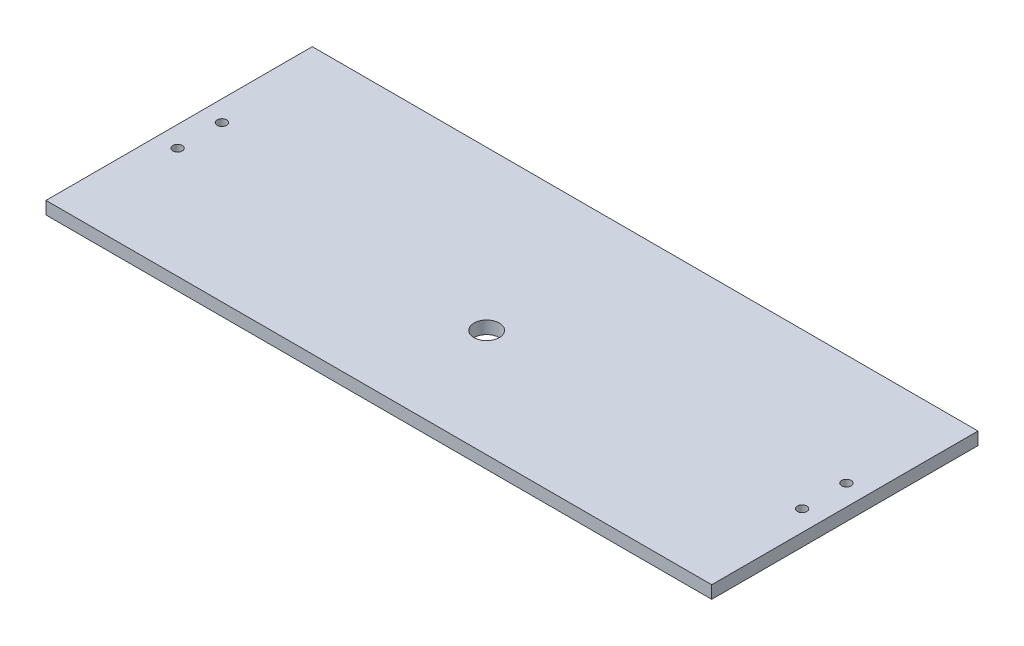
ISO-10303-21;
HEADER;
FILE_DESCRIPTION(('STEP AP214'),'2;1');
FILE_NAME('part.step','',(''),(''),'','','');
FILE_SCHEMA(('AUTOMOTIVE_DESIGN { 1 0 10303 214 1 1 1 1 }'));
ENDSEC;
DATA;
#1=APPLICATION_CONTEXT('core data for automotive mechanical design processes');
#2=APPLICATION_PROTOCOL_DEFINITION('international standard','automotive_design',2000,#1);
#3=PRODUCT_CONTEXT('',#1,'mechanical');
#4=PRODUCT('Part','Part','',(#3));
#5=PRODUCT_RELATED_PRODUCT_CATEGORY('part','',(#4));
#6=PRODUCT_DEFINITION_FORMATION('','',#4);
#7=PRODUCT_DEFINITION_CONTEXT('part definition',#1,'design');
#8=PRODUCT_DEFINITION('design','',#6,#7);
#9=PRODUCT_DEFINITION_SHAPE('','',#8);
#10=(LENGTH_UNIT() NAMED_UNIT(*) SI_UNIT(.MILLI.,.METRE.));
#11=(NAMED_UNIT(*) PLANE_ANGLE_UNIT() SI_UNIT($,.RADIAN.));
#12=(NAMED_UNIT(*) SI_UNIT($,.STERADIAN.) SOLID_ANGLE_UNIT());
#13=UNCERTAINTY_MEASURE_WITH_UNIT(LENGTH_MEASURE(1.E-05),#10,'distance_accuracy_value','');
#14=(GEOMETRIC_REPRESENTATION_CONTEXT(3) GLOBAL_UNCERTAINTY_ASSIGNED_CONTEXT((#13)) GLOBAL_UNIT_ASSIGNED_CONTEXT((#10,
#11,#12)) REPRESENTATION_CONTEXT('',''));
#15=CARTESIAN_POINT('',(0.,0.,0.));
#16=DIRECTION('',(0.,0.,1.));
#17=DIRECTION('',(1.,0.,0.));
#18=AXIS2_PLACEMENT_3D('',#15,#16,#17);
#19=CARTESIAN_POINT('',(119.498385096091,707.628389677579,-82.4394674818287));
#20=DIRECTION('',(1.,0.,0.));
#21=DIRECTION('',(0.,0.,-1.));
#22=AXIS2_PLACEMENT_3D('',#19,#20,#21);
#23=PLANE('',#22);
#24=DIRECTION('',(0.,0.,1.));
#25=VECTOR('',#24,1.);
#26=CARTESIAN_POINT('',(119.498385096091,703.628389677579,-82.4394674818287));
#27=LINE('',#26,#25);
#28=CARTESIAN_POINT('',(119.498385096091,703.628389677579,-82.4394674818287));
#29=VERTEX_POINT('',#28);
#30=CARTESIAN_POINT('',(119.498385096091,703.628389677579,1.56053251817128));
#31=VERTEX_POINT('',#30);
#32=EDGE_CURVE('E97',#29,#31,#27,.T.);
#33=ORIENTED_EDGE('',*,*,#32,.F.);
#34=DIRECTION('',(0.,-1.,0.));
#35=VECTOR('',#34,1.);
#36=CARTESIAN_POINT('',(119.498385096091,707.628389677579,-82.4394674818287));
#37=LINE('',#36,#35);
#38=CARTESIAN_POINT('',(119.498385096091,707.628389677579,-82.4394674818287));
#39=VERTEX_POINT('',#38);
#40=EDGE_CURVE('E11',#39,#29,#37,.T.);
#41=ORIENTED_EDGE('',*,*,#40,.F.);
#42=DIRECTION('',(0.,0.,1.));
#43=VECTOR('',#42,1.);
#44=CARTESIAN_POINT('',(119.498385096091,707.628389677579,-82.4394674818287));
#45=LINE('',#44,#43);
#46=CARTESIAN_POINT('',(119.498385096091,707.628389677579,1.56053251817128));
#47=VERTEX_POINT('',#46);
#48=EDGE_CURVE('E90',#39,#47,#45,.T.);
#49=ORIENTED_EDGE('',*,*,#48,.T.);
#50=DIRECTION('',(0.,-1.,0.));
#51=VECTOR('',#50,1.);
#52=CARTESIAN_POINT('',(119.498385096091,707.628389677579,1.56053251817128));
#53=LINE('',#52,#51);
#54=EDGE_CURVE('E35',#47,#31,#53,.T.);
#55=ORIENTED_EDGE('',*,*,#54,.T.);
#56=EDGE_LOOP('',(#33,#41,#49,#55));
#57=FACE_BOUND('',#56,.T.);
#58=ADVANCED_FACE('F32',(#57),#23,.T.);
#59=CARTESIAN_POINT('',(119.498385096091,707.628389677579,-82.4394674818287));
#60=DIRECTION('',(0.,0.,-1.));
#61=DIRECTION('',(0.,1.,0.));
#62=AXIS2_PLACEMENT_3D('',#59,#60,#61);
#63=PLANE('',#62);
#64=DIRECTION('',(1.,0.,0.));
#65=VECTOR('',#64,1.);
#66=CARTESIAN_POINT('',(119.498385096091,703.628389677579,-82.4394674818287));
#67=LINE('',#66,#65);
#68=CARTESIAN_POINT('',(-90.5016149039087,703.628389677579,-82.4394674818287));
#69=VERTEX_POINT('',#68);
#70=EDGE_CURVE('E92',#69,#29,#67,.T.);
#71=ORIENTED_EDGE('',*,*,#70,.F.);
#72=DIRECTION('',(0.,-1.,0.));
#73=VECTOR('',#72,1.);
#74=CARTESIAN_POINT('',(-90.5016149039087,707.628389677579,-82.4394674818287));
#75=LINE('',#74,#73);
#76=CARTESIAN_POINT('',(-90.5016149039087,707.628389677579,-82.4394674818287));
#77=VERTEX_POINT('',#76);
#78=EDGE_CURVE('E41',#77,#69,#75,.T.);
#79=ORIENTED_EDGE('',*,*,#78,.F.);
#80=DIRECTION('',(1.,0.,0.));
#81=VECTOR('',#80,1.);
#82=CARTESIAN_POINT('',(119.498385096091,707.628389677579,-82.4394674818287));
#83=LINE('',#82,#81);
#84=EDGE_CURVE('E87',#77,#39,#83,.T.);
#85=ORIENTED_EDGE('',*,*,#84,.T.);
#86=ORIENTED_EDGE('',*,*,#40,.T.);
#87=EDGE_LOOP('',(#71,#79,#85,#86));
#88=FACE_BOUND('',#87,.T.);
#89=ADVANCED_FACE('F108',(#88),#63,.T.);
#90=CARTESIAN_POINT('',(-90.5016149039087,707.628389677579,-82.4394674818287));
#91=DIRECTION('',(-1.,0.,0.));
#92=DIRECTION('',(0.,0.,1.));
#93=AXIS2_PLACEMENT_3D('',#90,#91,#92);
#94=PLANE('',#93);
#95=DIRECTION('',(0.,0.,-1.));
#96=VECTOR('',#95,1.);
#97=CARTESIAN_POINT('',(-90.5016149039087,703.628389677579,-82.4394674818287));
#98=LINE('',#97,#96);
#99=CARTESIAN_POINT('',(-90.5016149039087,703.628389677579,1.56053251817128));
#100=VERTEX_POINT('',#99);
#101=EDGE_CURVE('E82',#100,#69,#98,.T.);
#102=ORIENTED_EDGE('',*,*,#101,.F.);
#103=DIRECTION('',(0.,-1.,0.));
#104=VECTOR('',#103,1.);
#105=CARTESIAN_POINT('',(-90.5016149039087,707.628389677579,1.56053251817128));
#106=LINE('',#105,#104);
#107=CARTESIAN_POINT('',(-90.5016149039087,707.628389677579,1.56053251817128));
#108=VERTEX_POINT('',#107);
#109=EDGE_CURVE('E77',#108,#100,#106,.T.);
#110=ORIENTED_EDGE('',*,*,#109,.F.);
#111=DIRECTION('',(0.,0.,-1.));
#112=VECTOR('',#111,1.);
#113=CARTESIAN_POINT('',(-90.5016149039087,707.628389677579,-82.4394674818287));
#114=LINE('',#113,#112);
#115=EDGE_CURVE('E80',#108,#77,#114,.T.);
#116=ORIENTED_EDGE('',*,*,#115,.T.);
#117=ORIENTED_EDGE('',*,*,#78,.T.);
#118=EDGE_LOOP('',(#102,#110,#116,#117));
#119=FACE_BOUND('',#118,.T.);
#120=ADVANCED_FACE('F79',(#119),#94,.T.);
#121=CARTESIAN_POINT('',(119.498385096091,707.628389677579,1.56053251817128));
#122=DIRECTION('',(0.,0.,1.));
#123=DIRECTION('',(0.,-1.,0.));
#124=AXIS2_PLACEMENT_3D('',#121,#122,#123);
#125=PLANE('',#124);
#126=DIRECTION('',(-1.,0.,0.));
#127=VECTOR('',#126,1.);
#128=CARTESIAN_POINT('',(119.498385096091,703.628389677579,1.56053251817128));
#129=LINE('',#128,#127);
#130=EDGE_CURVE('E100',#31,#100,#129,.T.);
#131=ORIENTED_EDGE('',*,*,#130,.F.);
#132=ORIENTED_EDGE('',*,*,#54,.F.);
#133=DIRECTION('',(-1.,0.,0.));
#134=VECTOR('',#133,1.);
#135=CARTESIAN_POINT('',(119.498385096091,707.628389677579,1.56053251817128));
#136=LINE('',#135,#134);
#137=EDGE_CURVE('E86',#47,#108,#136,.T.);
#138=ORIENTED_EDGE('',*,*,#137,.T.);
#139=ORIENTED_EDGE('',*,*,#109,.T.);
#140=EDGE_LOOP('',(#131,#132,#138,#139));
#141=FACE_BOUND('',#140,.T.);
#142=ADVANCED_FACE('F89',(#141),#125,.T.);
#143=CARTESIAN_POINT('',(0.,707.628389677579,0.));
#144=DIRECTION('',(0.,-1.,0.));
#145=DIRECTION('',(0.,0.,-1.));
#146=AXIS2_PLACEMENT_3D('',#143,#144,#145);
#147=PLANE('',#146);
#148=CARTESIAN_POINT('',(-84.0016149039087,707.628389677579,-33.4394674818287));
#149=DIRECTION('',(0.,-1.,0.));
#150=DIRECTION('',(0.,0.,-1.));
#151=AXIS2_PLACEMENT_3D('',#148,#149,#150);
#152=CIRCLE('',#151,1.50000000000001);
#153=CARTESIAN_POINT('',(-84.0016149039087,707.628389677579,-34.9394674818287));
#154=VERTEX_POINT('',#153);
#155=EDGE_CURVE('E153',#154,#154,#152,.T.);
#156=ORIENTED_EDGE('',*,*,#155,.T.);
#157=EDGE_LOOP('',(#156));
#158=FACE_BOUND('',#157,.T.);
#159=CARTESIAN_POINT('',(-84.0016149039087,707.628389677579,-47.4394674818287));
#160=DIRECTION('',(0.,-1.,0.));
#161=DIRECTION('',(0.,0.,-1.));
#162=AXIS2_PLACEMENT_3D('',#159,#160,#161);
#163=CIRCLE('',#162,1.5);
#164=CARTESIAN_POINT('',(-84.0016149039087,707.628389677579,-48.9394674818287));
#165=VERTEX_POINT('',#164);
#166=EDGE_CURVE('E161',#165,#165,#163,.T.);
#167=ORIENTED_EDGE('',*,*,#166,.T.);
#168=EDGE_LOOP('',(#167));
#169=FACE_BOUND('',#168,.T.);
#170=CARTESIAN_POINT('',(112.998385096091,707.628389677579,-47.4394674818287));
#171=DIRECTION('',(0.,-1.,0.));
#172=DIRECTION('',(0.,0.,-1.));
#173=AXIS2_PLACEMENT_3D('',#170,#171,#172);
#174=CIRCLE('',#173,1.5);
#175=CARTESIAN_POINT('',(112.998385096091,707.628389677579,-48.9394674818287));
#176=VERTEX_POINT('',#175);
#177=EDGE_CURVE('E167',#176,#176,#174,.T.);
#178=ORIENTED_EDGE('',*,*,#177,.T.);
#179=EDGE_LOOP('',(#178));
#180=FACE_BOUND('',#179,.T.);
#181=CARTESIAN_POINT('',(112.998385096091,707.628389677579,-33.4394674818287));
#182=DIRECTION('',(0.,-1.,0.));
#183=DIRECTION('',(0.,0.,-1.));
#184=AXIS2_PLACEMENT_3D('',#181,#182,#183);
#185=CIRCLE('',#184,1.5);
#186=CARTESIAN_POINT('',(112.998385096091,707.628389677579,-34.9394674818287));
#187=VERTEX_POINT('',#186);
#188=EDGE_CURVE('E173',#187,#187,#185,.T.);
#189=ORIENTED_EDGE('',*,*,#188,.T.);
#190=EDGE_LOOP('',(#189));
#191=FACE_BOUND('',#190,.T.);
#192=CARTESIAN_POINT('',(14.4983850960913,707.628389677579,-32.4394674818287));
#193=DIRECTION('',(0.,-1.,0.));
#194=DIRECTION('',(0.,0.,-1.));
#195=AXIS2_PLACEMENT_3D('',#192,#193,#194);
#196=CIRCLE('',#195,4.00000000000001);
#197=CARTESIAN_POINT('',(14.4983850960913,707.628389677579,-36.4394674818287));
#198=VERTEX_POINT('',#197);
#199=EDGE_CURVE('E101',#198,#198,#196,.T.);
#200=ORIENTED_EDGE('',*,*,#199,.T.);
#201=EDGE_LOOP('',(#200));
#202=FACE_BOUND('',#201,.T.);
#203=ORIENTED_EDGE('',*,*,#48,.F.);
#204=ORIENTED_EDGE('',*,*,#84,.F.);
#205=ORIENTED_EDGE('',*,*,#115,.F.);
#206=ORIENTED_EDGE('',*,*,#137,.F.);
#207=EDGE_LOOP('',(#203,#204,#205,#206));
#208=FACE_BOUND('',#207,.T.);
#209=ADVANCED_FACE('F85',(#158,#169,#180,#191,#202,#208),#147,.F.);
#210=CARTESIAN_POINT('',(0.,703.628389677579,0.));
#211=DIRECTION('',(0.,-1.,0.));
#212=DIRECTION('',(0.,0.,-1.));
#213=AXIS2_PLACEMENT_3D('',#210,#211,#212);
#214=PLANE('',#213);
#215=CARTESIAN_POINT('',(-84.0016149039087,703.628389677579,-33.4394674818287));
#216=DIRECTION('',(0.,-1.,0.));
#217=DIRECTION('',(0.,0.,-1.));
#218=AXIS2_PLACEMENT_3D('',#215,#216,#217);
#219=CIRCLE('',#218,1.50000000000001);
#220=CARTESIAN_POINT('',(-84.0016149039087,703.628389677579,-34.9394674818287));
#221=VERTEX_POINT('',#220);
#222=EDGE_CURVE('E156',#221,#221,#219,.T.);
#223=ORIENTED_EDGE('',*,*,#222,.F.);
#224=EDGE_LOOP('',(#223));
#225=FACE_BOUND('',#224,.T.);
#226=CARTESIAN_POINT('',(-84.0016149039087,703.628389677579,-47.4394674818287));
#227=DIRECTION('',(0.,-1.,0.));
#228=DIRECTION('',(0.,0.,-1.));
#229=AXIS2_PLACEMENT_3D('',#226,#227,#228);
#230=CIRCLE('',#229,1.5);
#231=CARTESIAN_POINT('',(-84.0016149039087,703.628389677579,-48.9394674818287));
#232=VERTEX_POINT('',#231);
#233=EDGE_CURVE('E158',#232,#232,#230,.T.);
#234=ORIENTED_EDGE('',*,*,#233,.F.);
#235=EDGE_LOOP('',(#234));
#236=FACE_BOUND('',#235,.T.);
#237=CARTESIAN_POINT('',(112.998385096091,703.628389677579,-47.4394674818287));
#238=DIRECTION('',(0.,-1.,0.));
#239=DIRECTION('',(0.,0.,-1.));
#240=AXIS2_PLACEMENT_3D('',#237,#238,#239);
#241=CIRCLE('',#240,1.5);
#242=CARTESIAN_POINT('',(112.998385096091,703.628389677579,-48.9394674818287));
#243=VERTEX_POINT('',#242);
#244=EDGE_CURVE('E164',#243,#243,#241,.T.);
#245=ORIENTED_EDGE('',*,*,#244,.F.);
#246=EDGE_LOOP('',(#245));
#247=FACE_BOUND('',#246,.T.);
#248=CARTESIAN_POINT('',(112.998385096091,703.628389677579,-33.4394674818287));
#249=DIRECTION('',(0.,-1.,0.));
#250=DIRECTION('',(0.,0.,-1.));
#251=AXIS2_PLACEMENT_3D('',#248,#249,#250);
#252=CIRCLE('',#251,1.5);
#253=CARTESIAN_POINT('',(112.998385096091,703.628389677579,-34.9394674818287));
#254=VERTEX_POINT('',#253);
#255=EDGE_CURVE('E170',#254,#254,#252,.T.);
#256=ORIENTED_EDGE('',*,*,#255,.F.);
#257=EDGE_LOOP('',(#256));
#258=FACE_BOUND('',#257,.T.);
#259=CARTESIAN_POINT('',(14.4983850960913,703.628389677579,-32.4394674818287));
#260=DIRECTION('',(0.,-1.,0.));
#261=DIRECTION('',(0.,0.,-1.));
#262=AXIS2_PLACEMENT_3D('',#259,#260,#261);
#263=CIRCLE('',#262,4.00000000000001);
#264=CARTESIAN_POINT('',(14.4983850960913,703.628389677579,-36.4394674818287));
#265=VERTEX_POINT('',#264);
#266=EDGE_CURVE('E176',#265,#265,#263,.T.);
#267=ORIENTED_EDGE('',*,*,#266,.F.);
#268=EDGE_LOOP('',(#267));
#269=FACE_BOUND('',#268,.T.);
#270=ORIENTED_EDGE('',*,*,#32,.T.);
#271=ORIENTED_EDGE('',*,*,#130,.T.);
#272=ORIENTED_EDGE('',*,*,#101,.T.);
#273=ORIENTED_EDGE('',*,*,#70,.T.);
#274=EDGE_LOOP('',(#270,#271,#272,#273));
#275=FACE_BOUND('',#274,.T.);
#276=ADVANCED_FACE('F107',(#225,#236,#247,#258,#269,#275),#214,.T.);
#277=CARTESIAN_POINT('',(14.4983850960913,707.628389677579,-32.4394674818287));
#278=DIRECTION('',(0.,-1.,0.));
#279=DIRECTION('',(0.,0.,-1.));
#280=AXIS2_PLACEMENT_3D('',#277,#278,#279);
#281=CYLINDRICAL_SURFACE('',#280,4.00000000000001);
#282=ORIENTED_EDGE('',*,*,#199,.F.);
#283=EDGE_LOOP('',(#282));
#284=FACE_BOUND('',#283,.T.);
#285=ORIENTED_EDGE('',*,*,#266,.T.);
#286=EDGE_LOOP('',(#285));
#287=FACE_BOUND('',#286,.T.);
#288=ADVANCED_FACE('F126',(#284,#287),#281,.F.);
#289=CARTESIAN_POINT('',(112.998385096091,707.628389677579,-33.4394674818287));
#290=DIRECTION('',(0.,-1.,0.));
#291=DIRECTION('',(0.,0.,-1.));
#292=AXIS2_PLACEMENT_3D('',#289,#290,#291);
#293=CYLINDRICAL_SURFACE('',#292,1.5);
#294=ORIENTED_EDGE('',*,*,#188,.F.);
#295=EDGE_LOOP('',(#294));
#296=FACE_BOUND('',#295,.T.);
#297=ORIENTED_EDGE('',*,*,#255,.T.);
#298=EDGE_LOOP('',(#297));
#299=FACE_BOUND('',#298,.T.);
#300=ADVANCED_FACE('F133',(#296,#299),#293,.F.);
#301=CARTESIAN_POINT('',(112.998385096091,707.628389677579,-47.4394674818287));
#302=DIRECTION('',(0.,-1.,0.));
#303=DIRECTION('',(0.,0.,-1.));
#304=AXIS2_PLACEMENT_3D('',#301,#302,#303);
#305=CYLINDRICAL_SURFACE('',#304,1.5);
#306=ORIENTED_EDGE('',*,*,#177,.F.);
#307=EDGE_LOOP('',(#306));
#308=FACE_BOUND('',#307,.T.);
#309=ORIENTED_EDGE('',*,*,#244,.T.);
#310=EDGE_LOOP('',(#309));
#311=FACE_BOUND('',#310,.T.);
#312=ADVANCED_FACE('F137',(#308,#311),#305,.F.);
#313=CARTESIAN_POINT('',(-84.0016149039087,707.628389677579,-47.4394674818287));
#314=DIRECTION('',(0.,-1.,0.));
#315=DIRECTION('',(0.,0.,-1.));
#316=AXIS2_PLACEMENT_3D('',#313,#314,#315);
#317=CYLINDRICAL_SURFACE('',#316,1.5);
#318=ORIENTED_EDGE('',*,*,#166,.F.);
#319=EDGE_LOOP('',(#318));
#320=FACE_BOUND('',#319,.T.);
#321=ORIENTED_EDGE('',*,*,#233,.T.);
#322=EDGE_LOOP('',(#321));
#323=FACE_BOUND('',#322,.T.);
#324=ADVANCED_FACE('F141',(#320,#323),#317,.F.);
#325=CARTESIAN_POINT('',(-84.0016149039087,707.628389677579,-33.4394674818287));
#326=DIRECTION('',(0.,-1.,0.));
#327=DIRECTION('',(0.,0.,-1.));
#328=AXIS2_PLACEMENT_3D('',#325,#326,#327);
#329=CYLINDRICAL_SURFACE('',#328,1.50000000000001);
#330=ORIENTED_EDGE('',*,*,#155,.F.);
#331=EDGE_LOOP('',(#330));
#332=FACE_BOUND('',#331,.T.);
#333=ORIENTED_EDGE('',*,*,#222,.T.);
#334=EDGE_LOOP('',(#333));
#335=FACE_BOUND('',#334,.T.);
#336=ADVANCED_FACE('F145',(#332,#335),#329,.F.);
#337=CLOSED_SHELL('',(#58,#89,#120,#142,#209,#276,#288,#300,#312,#324,#336));
#338=MANIFOLD_SOLID_BREP('B2',#337);
#339=ADVANCED_BREP_SHAPE_REPRESENTATION('',(#18,#338),#14);
#340=SHAPE_DEFINITION_REPRESENTATION(#9,#339);
ENDSEC;
END-ISO-10303-21;
